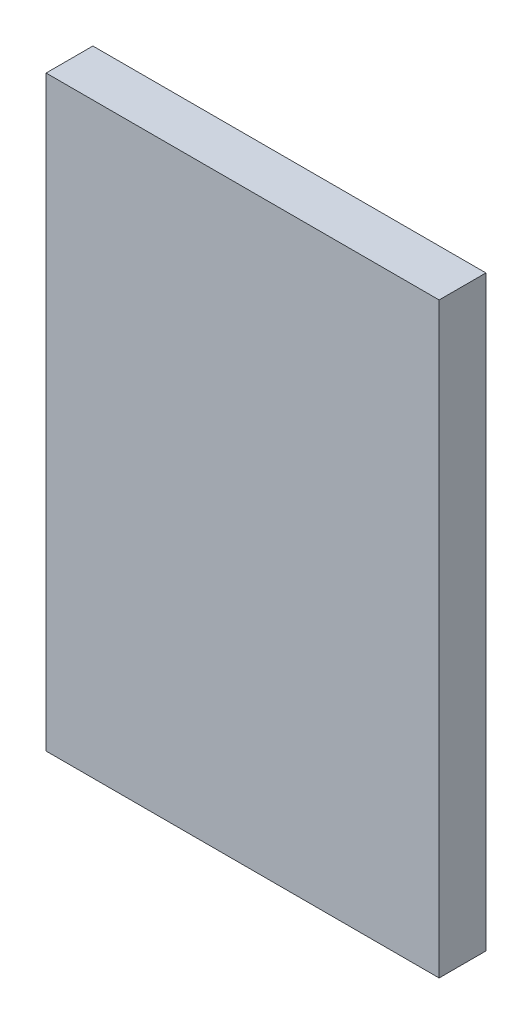
ISO-10303-21;
HEADER;
FILE_DESCRIPTION(('STEP AP214'),'2;1');
FILE_NAME('part.step','',(''),(''),'','','');
FILE_SCHEMA(('AUTOMOTIVE_DESIGN { 1 0 10303 214 1 1 1 1 }'));
ENDSEC;
DATA;
#1=APPLICATION_CONTEXT('core data for automotive mechanical design processes');
#2=APPLICATION_PROTOCOL_DEFINITION('international standard','automotive_design',2000,#1);
#3=PRODUCT_CONTEXT('',#1,'mechanical');
#4=PRODUCT('Part','Part','',(#3));
#5=PRODUCT_RELATED_PRODUCT_CATEGORY('part','',(#4));
#6=PRODUCT_DEFINITION_FORMATION('','',#4);
#7=PRODUCT_DEFINITION_CONTEXT('part definition',#1,'design');
#8=PRODUCT_DEFINITION('design','',#6,#7);
#9=PRODUCT_DEFINITION_SHAPE('','',#8);
#10=(LENGTH_UNIT() NAMED_UNIT(*) SI_UNIT(.MILLI.,.METRE.));
#11=(NAMED_UNIT(*) PLANE_ANGLE_UNIT() SI_UNIT($,.RADIAN.));
#12=(NAMED_UNIT(*) SI_UNIT($,.STERADIAN.) SOLID_ANGLE_UNIT());
#13=UNCERTAINTY_MEASURE_WITH_UNIT(LENGTH_MEASURE(1.E-05),#10,'distance_accuracy_value','');
#14=(GEOMETRIC_REPRESENTATION_CONTEXT(3) GLOBAL_UNCERTAINTY_ASSIGNED_CONTEXT((#13)) GLOBAL_UNIT_ASSIGNED_CONTEXT((#10,
#11,#12)) REPRESENTATION_CONTEXT('',''));
#15=CARTESIAN_POINT('',(0.,0.,0.));
#16=DIRECTION('',(0.,0.,1.));
#17=DIRECTION('',(1.,0.,0.));
#18=AXIS2_PLACEMENT_3D('',#15,#16,#17);
#19=CARTESIAN_POINT('',(0.,0.,5.08));
#20=DIRECTION('',(1.,0.,0.));
#21=DIRECTION('',(0.,0.,-1.));
#22=AXIS2_PLACEMENT_3D('',#19,#20,#21);
#23=PLANE('',#22);
#24=DIRECTION('',(0.,-1.,0.));
#25=VECTOR('',#24,1.);
#26=CARTESIAN_POINT('',(0.,0.,0.));
#27=LINE('',#26,#25);
#28=CARTESIAN_POINT('',(0.,63.754,0.));
#29=VERTEX_POINT('',#28);
#30=CARTESIAN_POINT('',(0.,0.,0.));
#31=VERTEX_POINT('',#30);
#32=EDGE_CURVE('E96',#29,#31,#27,.T.);
#33=ORIENTED_EDGE('',*,*,#32,.T.);
#34=DIRECTION('',(0.,0.,-1.));
#35=VECTOR('',#34,1.);
#36=CARTESIAN_POINT('',(0.,0.,5.08));
#37=LINE('',#36,#35);
#38=CARTESIAN_POINT('',(0.,0.,5.08));
#39=VERTEX_POINT('',#38);
#40=EDGE_CURVE('E11',#39,#31,#37,.T.);
#41=ORIENTED_EDGE('',*,*,#40,.F.);
#42=DIRECTION('',(0.,-1.,0.));
#43=VECTOR('',#42,1.);
#44=CARTESIAN_POINT('',(0.,0.,5.08));
#45=LINE('',#44,#43);
#46=CARTESIAN_POINT('',(0.,63.754,5.08));
#47=VERTEX_POINT('',#46);
#48=EDGE_CURVE('E84',#47,#39,#45,.T.);
#49=ORIENTED_EDGE('',*,*,#48,.F.);
#50=DIRECTION('',(0.,0.,-1.));
#51=VECTOR('',#50,1.);
#52=CARTESIAN_POINT('',(0.,63.754,5.08));
#53=LINE('',#52,#51);
#54=EDGE_CURVE('E92',#47,#29,#53,.T.);
#55=ORIENTED_EDGE('',*,*,#54,.T.);
#56=EDGE_LOOP('',(#33,#41,#49,#55));
#57=FACE_BOUND('',#56,.T.);
#58=ADVANCED_FACE('F33',(#57),#23,.F.);
#59=CARTESIAN_POINT('',(0.,0.,5.08));
#60=DIRECTION('',(0.,1.,0.));
#61=DIRECTION('',(0.,0.,1.));
#62=AXIS2_PLACEMENT_3D('',#59,#60,#61);
#63=PLANE('',#62);
#64=DIRECTION('',(1.,0.,0.));
#65=VECTOR('',#64,1.);
#66=CARTESIAN_POINT('',(0.,0.,0.));
#67=LINE('',#66,#65);
#68=CARTESIAN_POINT('',(42.672,0.,0.));
#69=VERTEX_POINT('',#68);
#70=EDGE_CURVE('E88',#31,#69,#67,.T.);
#71=ORIENTED_EDGE('',*,*,#70,.T.);
#72=DIRECTION('',(0.,0.,-1.));
#73=VECTOR('',#72,1.);
#74=CARTESIAN_POINT('',(42.672,0.,5.08));
#75=LINE('',#74,#73);
#76=CARTESIAN_POINT('',(42.672,0.,5.08));
#77=VERTEX_POINT('',#76);
#78=EDGE_CURVE('E41',#77,#69,#75,.T.);
#79=ORIENTED_EDGE('',*,*,#78,.F.);
#80=DIRECTION('',(1.,0.,0.));
#81=VECTOR('',#80,1.);
#82=CARTESIAN_POINT('',(0.,0.,5.08));
#83=LINE('',#82,#81);
#84=EDGE_CURVE('E79',#39,#77,#83,.T.);
#85=ORIENTED_EDGE('',*,*,#84,.F.);
#86=ORIENTED_EDGE('',*,*,#40,.T.);
#87=EDGE_LOOP('',(#71,#79,#85,#86));
#88=FACE_BOUND('',#87,.T.);
#89=ADVANCED_FACE('F87',(#88),#63,.F.);
#90=CARTESIAN_POINT('',(42.672,0.,5.08));
#91=DIRECTION('',(-1.,0.,0.));
#92=DIRECTION('',(0.,0.,1.));
#93=AXIS2_PLACEMENT_3D('',#90,#91,#92);
#94=PLANE('',#93);
#95=DIRECTION('',(0.,1.,0.));
#96=VECTOR('',#95,1.);
#97=CARTESIAN_POINT('',(42.672,0.,0.));
#98=LINE('',#97,#96);
#99=CARTESIAN_POINT('',(42.672,63.754,0.));
#100=VERTEX_POINT('',#99);
#101=EDGE_CURVE('E66',#69,#100,#98,.T.);
#102=ORIENTED_EDGE('',*,*,#101,.T.);
#103=DIRECTION('',(0.,0.,-1.));
#104=VECTOR('',#103,1.);
#105=CARTESIAN_POINT('',(42.672,63.754,5.08));
#106=LINE('',#105,#104);
#107=CARTESIAN_POINT('',(42.672,63.754,5.08));
#108=VERTEX_POINT('',#107);
#109=EDGE_CURVE('E89',#108,#100,#106,.T.);
#110=ORIENTED_EDGE('',*,*,#109,.F.);
#111=DIRECTION('',(0.,1.,0.));
#112=VECTOR('',#111,1.);
#113=CARTESIAN_POINT('',(42.672,0.,5.08));
#114=LINE('',#113,#112);
#115=EDGE_CURVE('E82',#77,#108,#114,.T.);
#116=ORIENTED_EDGE('',*,*,#115,.F.);
#117=ORIENTED_EDGE('',*,*,#78,.T.);
#118=EDGE_LOOP('',(#102,#110,#116,#117));
#119=FACE_BOUND('',#118,.T.);
#120=ADVANCED_FACE('F90',(#119),#94,.F.);
#121=CARTESIAN_POINT('',(0.,63.754,5.08));
#122=DIRECTION('',(0.,-1.,0.));
#123=DIRECTION('',(0.,0.,-1.));
#124=AXIS2_PLACEMENT_3D('',#121,#122,#123);
#125=PLANE('',#124);
#126=DIRECTION('',(-1.,0.,0.));
#127=VECTOR('',#126,1.);
#128=CARTESIAN_POINT('',(0.,63.754,0.));
#129=LINE('',#128,#127);
#130=EDGE_CURVE('E72',#100,#29,#129,.T.);
#131=ORIENTED_EDGE('',*,*,#130,.T.);
#132=ORIENTED_EDGE('',*,*,#54,.F.);
#133=DIRECTION('',(-1.,0.,0.));
#134=VECTOR('',#133,1.);
#135=CARTESIAN_POINT('',(0.,63.754,5.08));
#136=LINE('',#135,#134);
#137=EDGE_CURVE('E49',#108,#47,#136,.T.);
#138=ORIENTED_EDGE('',*,*,#137,.F.);
#139=ORIENTED_EDGE('',*,*,#109,.T.);
#140=EDGE_LOOP('',(#131,#132,#138,#139));
#141=FACE_BOUND('',#140,.T.);
#142=ADVANCED_FACE('F103',(#141),#125,.F.);
#143=CARTESIAN_POINT('',(0.,0.,5.08));
#144=DIRECTION('',(0.,0.,-1.));
#145=DIRECTION('',(-1.,0.,0.));
#146=AXIS2_PLACEMENT_3D('',#143,#144,#145);
#147=PLANE('',#146);
#148=ORIENTED_EDGE('',*,*,#48,.T.);
#149=ORIENTED_EDGE('',*,*,#84,.T.);
#150=ORIENTED_EDGE('',*,*,#115,.T.);
#151=ORIENTED_EDGE('',*,*,#137,.T.);
#152=EDGE_LOOP('',(#148,#149,#150,#151));
#153=FACE_BOUND('',#152,.T.);
#154=ADVANCED_FACE('F80',(#153),#147,.F.);
#155=CARTESIAN_POINT('',(0.,0.,0.));
#156=DIRECTION('',(0.,0.,-1.));
#157=DIRECTION('',(-1.,0.,0.));
#158=AXIS2_PLACEMENT_3D('',#155,#156,#157);
#159=PLANE('',#158);
#160=ORIENTED_EDGE('',*,*,#32,.F.);
#161=ORIENTED_EDGE('',*,*,#130,.F.);
#162=ORIENTED_EDGE('',*,*,#101,.F.);
#163=ORIENTED_EDGE('',*,*,#70,.F.);
#164=EDGE_LOOP('',(#160,#161,#162,#163));
#165=FACE_BOUND('',#164,.T.);
#166=ADVANCED_FACE('F106',(#165),#159,.T.);
#167=CLOSED_SHELL('',(#58,#89,#120,#142,#154,#166));
#168=MANIFOLD_SOLID_BREP('B2',#167);
#169=ADVANCED_BREP_SHAPE_REPRESENTATION('',(#18,#168),#14);
#170=SHAPE_DEFINITION_REPRESENTATION(#9,#169);
ENDSEC;
END-ISO-10303-21;
